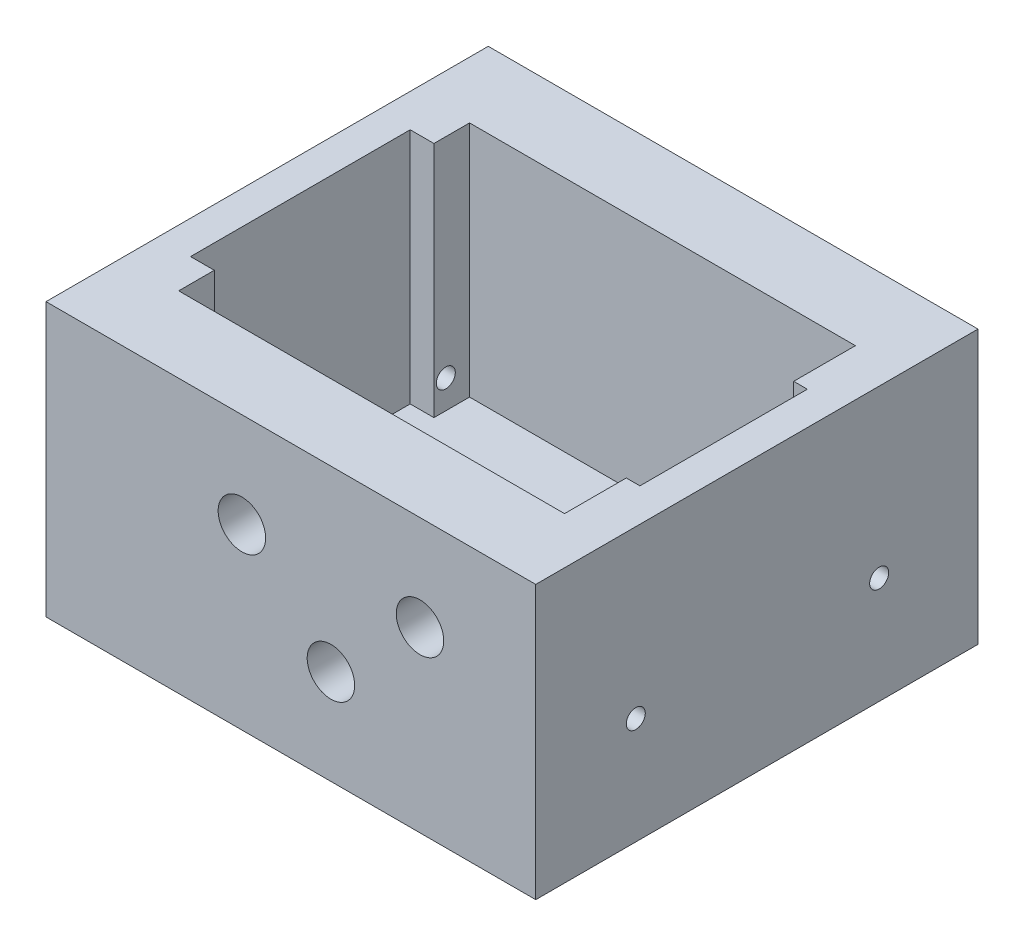
ISO-10303-21;
HEADER;
FILE_DESCRIPTION(('STEP AP214'),'2;1');
FILE_NAME('part.step','',(''),(''),'','','');
FILE_SCHEMA(('AUTOMOTIVE_DESIGN { 1 0 10303 214 1 1 1 1 }'));
ENDSEC;
DATA;
#1=APPLICATION_CONTEXT('core data for automotive mechanical design processes');
#2=APPLICATION_PROTOCOL_DEFINITION('international standard','automotive_design',2000,#1);
#3=PRODUCT_CONTEXT('',#1,'mechanical');
#4=PRODUCT('Part','Part','',(#3));
#5=PRODUCT_RELATED_PRODUCT_CATEGORY('part','',(#4));
#6=PRODUCT_DEFINITION_FORMATION('','',#4);
#7=PRODUCT_DEFINITION_CONTEXT('part definition',#1,'design');
#8=PRODUCT_DEFINITION('design','',#6,#7);
#9=PRODUCT_DEFINITION_SHAPE('','',#8);
#10=(LENGTH_UNIT() NAMED_UNIT(*) SI_UNIT(.MILLI.,.METRE.));
#11=(NAMED_UNIT(*) PLANE_ANGLE_UNIT() SI_UNIT($,.RADIAN.));
#12=(NAMED_UNIT(*) SI_UNIT($,.STERADIAN.) SOLID_ANGLE_UNIT());
#13=UNCERTAINTY_MEASURE_WITH_UNIT(LENGTH_MEASURE(1.E-05),#10,'distance_accuracy_value','');
#14=(GEOMETRIC_REPRESENTATION_CONTEXT(3) GLOBAL_UNCERTAINTY_ASSIGNED_CONTEXT((#13)) GLOBAL_UNIT_ASSIGNED_CONTEXT((#10,
#11,#12)) REPRESENTATION_CONTEXT('',''));
#15=CARTESIAN_POINT('',(0.,0.,0.));
#16=DIRECTION('',(0.,0.,1.));
#17=DIRECTION('',(1.,0.,0.));
#18=AXIS2_PLACEMENT_3D('',#15,#16,#17);
#19=CARTESIAN_POINT('',(0.,23.,0.));
#20=DIRECTION('',(1.,0.,0.));
#21=DIRECTION('',(0.,0.,-1.));
#22=AXIS2_PLACEMENT_3D('',#19,#20,#21);
#23=PLANE('',#22);
#24=CARTESIAN_POINT('',(0.,5.4,-28.875));
#25=DIRECTION('',(1.,0.,0.));
#26=DIRECTION('',(0.,0.,-1.));
#27=AXIS2_PLACEMENT_3D('',#24,#25,#26);
#28=CIRCLE('',#27,0.799999999999999);
#29=CARTESIAN_POINT('',(0.,5.4,-29.675));
#30=VERTEX_POINT('',#29);
#31=EDGE_CURVE('E375',#30,#30,#28,.F.);
#32=ORIENTED_EDGE('',*,*,#31,.F.);
#33=EDGE_LOOP('',(#32));
#34=FACE_BOUND('',#33,.T.);
#35=CARTESIAN_POINT('',(0.,5.4,-8.375));
#36=DIRECTION('',(1.,0.,0.));
#37=DIRECTION('',(0.,0.,-1.));
#38=AXIS2_PLACEMENT_3D('',#35,#36,#37);
#39=CIRCLE('',#38,0.800000000000001);
#40=CARTESIAN_POINT('',(0.,5.4,-9.175));
#41=VERTEX_POINT('',#40);
#42=EDGE_CURVE('E378',#41,#41,#39,.F.);
#43=ORIENTED_EDGE('',*,*,#42,.F.);
#44=EDGE_LOOP('',(#43));
#45=FACE_BOUND('',#44,.T.);
#46=DIRECTION('',(0.,0.,1.));
#47=VECTOR('',#46,1.);
#48=CARTESIAN_POINT('',(0.,0.,0.));
#49=LINE('',#48,#47);
#50=CARTESIAN_POINT('',(0.,0.,-37.25));
#51=VERTEX_POINT('',#50);
#52=CARTESIAN_POINT('',(0.,0.,0.));
#53=VERTEX_POINT('',#52);
#54=EDGE_CURVE('E277',#51,#53,#49,.T.);
#55=ORIENTED_EDGE('',*,*,#54,.T.);
#56=DIRECTION('',(0.,-1.,0.));
#57=VECTOR('',#56,1.);
#58=CARTESIAN_POINT('',(0.,23.,0.));
#59=LINE('',#58,#57);
#60=CARTESIAN_POINT('',(0.,23.,0.));
#61=VERTEX_POINT('',#60);
#62=EDGE_CURVE('E11',#61,#53,#59,.T.);
#63=ORIENTED_EDGE('',*,*,#62,.F.);
#64=DIRECTION('',(0.,0.,1.));
#65=VECTOR('',#64,1.);
#66=CARTESIAN_POINT('',(0.,23.,0.));
#67=LINE('',#66,#65);
#68=CARTESIAN_POINT('',(0.,23.,-37.25));
#69=VERTEX_POINT('',#68);
#70=EDGE_CURVE('E307',#69,#61,#67,.T.);
#71=ORIENTED_EDGE('',*,*,#70,.F.);
#72=DIRECTION('',(0.,-1.,0.));
#73=VECTOR('',#72,1.);
#74=CARTESIAN_POINT('',(0.,23.,-37.25));
#75=LINE('',#74,#73);
#76=EDGE_CURVE('E317',#69,#51,#75,.T.);
#77=ORIENTED_EDGE('',*,*,#76,.T.);
#78=EDGE_LOOP('',(#55,#63,#71,#77));
#79=FACE_BOUND('',#78,.T.);
#80=ADVANCED_FACE('F42',(#34,#45,#79),#23,.F.);
#81=CARTESIAN_POINT('',(0.,23.,0.));
#82=DIRECTION('',(0.,0.,-1.));
#83=DIRECTION('',(-1.,0.,0.));
#84=AXIS2_PLACEMENT_3D('',#81,#82,#83);
#85=PLANE('',#84);
#86=CARTESIAN_POINT('',(16.5,15.,0.));
#87=DIRECTION('',(0.,0.,1.));
#88=DIRECTION('',(1.,0.,0.));
#89=AXIS2_PLACEMENT_3D('',#86,#87,#88);
#90=CIRCLE('',#89,2.);
#91=CARTESIAN_POINT('',(18.5,15.,0.));
#92=VERTEX_POINT('',#91);
#93=EDGE_CURVE('E426',#92,#92,#90,.T.);
#94=ORIENTED_EDGE('',*,*,#93,.F.);
#95=EDGE_LOOP('',(#94));
#96=FACE_BOUND('',#95,.T.);
#97=CARTESIAN_POINT('',(31.5,15.,0.));
#98=DIRECTION('',(0.,0.,1.));
#99=DIRECTION('',(1.,0.,0.));
#100=AXIS2_PLACEMENT_3D('',#97,#98,#99);
#101=CIRCLE('',#100,2.);
#102=CARTESIAN_POINT('',(33.5,15.,0.));
#103=VERTEX_POINT('',#102);
#104=EDGE_CURVE('E422',#103,#103,#101,.T.);
#105=ORIENTED_EDGE('',*,*,#104,.F.);
#106=EDGE_LOOP('',(#105));
#107=FACE_BOUND('',#106,.T.);
#108=CARTESIAN_POINT('',(24.,8.,0.));
#109=DIRECTION('',(0.,0.,1.));
#110=DIRECTION('',(1.,0.,0.));
#111=AXIS2_PLACEMENT_3D('',#108,#109,#110);
#112=CIRCLE('',#111,2.);
#113=CARTESIAN_POINT('',(26.,8.,0.));
#114=VERTEX_POINT('',#113);
#115=EDGE_CURVE('E413',#114,#114,#112,.T.);
#116=ORIENTED_EDGE('',*,*,#115,.F.);
#117=EDGE_LOOP('',(#116));
#118=FACE_BOUND('',#117,.T.);
#119=DIRECTION('',(1.,0.,0.));
#120=VECTOR('',#119,1.);
#121=CARTESIAN_POINT('',(0.,0.,0.));
#122=LINE('',#121,#120);
#123=CARTESIAN_POINT('',(41.25,0.,0.));
#124=VERTEX_POINT('',#123);
#125=EDGE_CURVE('E321',#53,#124,#122,.T.);
#126=ORIENTED_EDGE('',*,*,#125,.T.);
#127=DIRECTION('',(0.,-1.,0.));
#128=VECTOR('',#127,1.);
#129=CARTESIAN_POINT('',(41.25,23.,0.));
#130=LINE('',#129,#128);
#131=CARTESIAN_POINT('',(41.25,23.,0.));
#132=VERTEX_POINT('',#131);
#133=EDGE_CURVE('E50',#132,#124,#130,.T.);
#134=ORIENTED_EDGE('',*,*,#133,.F.);
#135=DIRECTION('',(1.,0.,0.));
#136=VECTOR('',#135,1.);
#137=CARTESIAN_POINT('',(0.,23.,0.));
#138=LINE('',#137,#136);
#139=EDGE_CURVE('E94',#61,#132,#138,.T.);
#140=ORIENTED_EDGE('',*,*,#139,.F.);
#141=ORIENTED_EDGE('',*,*,#62,.T.);
#142=EDGE_LOOP('',(#126,#134,#140,#141));
#143=FACE_BOUND('',#142,.T.);
#144=ADVANCED_FACE('F359',(#96,#107,#118,#143),#85,.F.);
#145=CARTESIAN_POINT('',(41.25,23.,0.));
#146=DIRECTION('',(-1.,0.,0.));
#147=DIRECTION('',(0.,0.,1.));
#148=AXIS2_PLACEMENT_3D('',#145,#146,#147);
#149=PLANE('',#148);
#150=CARTESIAN_POINT('',(41.25,9.,-28.925));
#151=DIRECTION('',(-1.,0.,0.));
#152=DIRECTION('',(0.,0.,1.));
#153=AXIS2_PLACEMENT_3D('',#150,#151,#152);
#154=CIRCLE('',#153,0.799999999999999);
#155=CARTESIAN_POINT('',(41.25,9.,-28.125));
#156=VERTEX_POINT('',#155);
#157=EDGE_CURVE('E236',#156,#156,#154,.F.);
#158=ORIENTED_EDGE('',*,*,#157,.F.);
#159=EDGE_LOOP('',(#158));
#160=FACE_BOUND('',#159,.T.);
#161=CARTESIAN_POINT('',(41.25,9.,-8.425));
#162=DIRECTION('',(-1.,0.,0.));
#163=DIRECTION('',(0.,0.,1.));
#164=AXIS2_PLACEMENT_3D('',#161,#162,#163);
#165=CIRCLE('',#164,0.800000000000002);
#166=CARTESIAN_POINT('',(41.25,9.,-7.625));
#167=VERTEX_POINT('',#166);
#168=EDGE_CURVE('E195',#167,#167,#165,.F.);
#169=ORIENTED_EDGE('',*,*,#168,.F.);
#170=EDGE_LOOP('',(#169));
#171=FACE_BOUND('',#170,.T.);
#172=DIRECTION('',(0.,0.,-1.));
#173=VECTOR('',#172,1.);
#174=CARTESIAN_POINT('',(41.25,0.,0.));
#175=LINE('',#174,#173);
#176=CARTESIAN_POINT('',(41.25,0.,-37.25));
#177=VERTEX_POINT('',#176);
#178=EDGE_CURVE('E324',#124,#177,#175,.T.);
#179=ORIENTED_EDGE('',*,*,#178,.T.);
#180=DIRECTION('',(0.,-1.,0.));
#181=VECTOR('',#180,1.);
#182=CARTESIAN_POINT('',(41.25,23.,-37.25));
#183=LINE('',#182,#181);
#184=CARTESIAN_POINT('',(41.25,23.,-37.25));
#185=VERTEX_POINT('',#184);
#186=EDGE_CURVE('E331',#185,#177,#183,.T.);
#187=ORIENTED_EDGE('',*,*,#186,.F.);
#188=DIRECTION('',(0.,0.,-1.));
#189=VECTOR('',#188,1.);
#190=CARTESIAN_POINT('',(41.25,23.,0.));
#191=LINE('',#190,#189);
#192=EDGE_CURVE('E312',#132,#185,#191,.T.);
#193=ORIENTED_EDGE('',*,*,#192,.F.);
#194=ORIENTED_EDGE('',*,*,#133,.T.);
#195=EDGE_LOOP('',(#179,#187,#193,#194));
#196=FACE_BOUND('',#195,.T.);
#197=ADVANCED_FACE('F338',(#160,#171,#196),#149,.F.);
#198=CARTESIAN_POINT('',(0.,23.,-37.25));
#199=DIRECTION('',(0.,0.,1.));
#200=DIRECTION('',(1.,0.,0.));
#201=AXIS2_PLACEMENT_3D('',#198,#199,#200);
#202=PLANE('',#201);
#203=CARTESIAN_POINT('',(16.5,15.,-37.25));
#204=DIRECTION('',(0.,0.,1.));
#205=DIRECTION('',(1.,0.,0.));
#206=AXIS2_PLACEMENT_3D('',#203,#204,#205);
#207=CIRCLE('',#206,2.);
#208=CARTESIAN_POINT('',(18.5,15.,-37.25));
#209=VERTEX_POINT('',#208);
#210=EDGE_CURVE('E449',#209,#209,#207,.T.);
#211=ORIENTED_EDGE('',*,*,#210,.T.);
#212=EDGE_LOOP('',(#211));
#213=FACE_BOUND('',#212,.T.);
#214=CARTESIAN_POINT('',(31.5,15.,-37.25));
#215=DIRECTION('',(0.,0.,1.));
#216=DIRECTION('',(1.,0.,0.));
#217=AXIS2_PLACEMENT_3D('',#214,#215,#216);
#218=CIRCLE('',#217,2.);
#219=CARTESIAN_POINT('',(33.5,15.,-37.25));
#220=VERTEX_POINT('',#219);
#221=EDGE_CURVE('E441',#220,#220,#218,.T.);
#222=ORIENTED_EDGE('',*,*,#221,.T.);
#223=EDGE_LOOP('',(#222));
#224=FACE_BOUND('',#223,.T.);
#225=CARTESIAN_POINT('',(24.,8.,-37.25));
#226=DIRECTION('',(0.,0.,1.));
#227=DIRECTION('',(1.,0.,0.));
#228=AXIS2_PLACEMENT_3D('',#225,#226,#227);
#229=CIRCLE('',#228,2.);
#230=CARTESIAN_POINT('',(26.,8.,-37.25));
#231=VERTEX_POINT('',#230);
#232=EDGE_CURVE('E433',#231,#231,#229,.T.);
#233=ORIENTED_EDGE('',*,*,#232,.T.);
#234=EDGE_LOOP('',(#233));
#235=FACE_BOUND('',#234,.T.);
#236=DIRECTION('',(-1.,0.,0.));
#237=VECTOR('',#236,1.);
#238=CARTESIAN_POINT('',(0.,0.,-37.25));
#239=LINE('',#238,#237);
#240=EDGE_CURVE('E87',#177,#51,#239,.T.);
#241=ORIENTED_EDGE('',*,*,#240,.T.);
#242=ORIENTED_EDGE('',*,*,#76,.F.);
#243=DIRECTION('',(-1.,0.,0.));
#244=VECTOR('',#243,1.);
#245=CARTESIAN_POINT('',(0.,23.,-37.25));
#246=LINE('',#245,#244);
#247=EDGE_CURVE('E66',#185,#69,#246,.T.);
#248=ORIENTED_EDGE('',*,*,#247,.F.);
#249=ORIENTED_EDGE('',*,*,#186,.T.);
#250=EDGE_LOOP('',(#241,#242,#248,#249));
#251=FACE_BOUND('',#250,.T.);
#252=ADVANCED_FACE('F346',(#213,#224,#235,#251),#202,.F.);
#253=CARTESIAN_POINT('',(0.,23.,0.));
#254=DIRECTION('',(0.,-1.,0.));
#255=DIRECTION('',(0.,0.,-1.));
#256=AXIS2_PLACEMENT_3D('',#253,#254,#255);
#257=PLANE('',#256);
#258=DIRECTION('',(-1.,0.,0.));
#259=VECTOR('',#258,1.);
#260=CARTESIAN_POINT('',(4.8,23.,-27.875));
#261=LINE('',#260,#259);
#262=CARTESIAN_POINT('',(4.8,23.,-27.875));
#263=VERTEX_POINT('',#262);
#264=CARTESIAN_POINT('',(2.80000000000001,23.,-27.875));
#265=VERTEX_POINT('',#264);
#266=EDGE_CURVE('E235',#263,#265,#261,.T.);
#267=ORIENTED_EDGE('',*,*,#266,.F.);
#268=DIRECTION('',(0.,0.,1.));
#269=VECTOR('',#268,1.);
#270=CARTESIAN_POINT('',(4.8,23.,-30.875));
#271=LINE('',#270,#269);
#272=CARTESIAN_POINT('',(4.8,23.,-30.875));
#273=VERTEX_POINT('',#272);
#274=EDGE_CURVE('E57',#273,#263,#271,.T.);
#275=ORIENTED_EDGE('',*,*,#274,.F.);
#276=DIRECTION('',(-1.,0.,0.));
#277=VECTOR('',#276,1.);
#278=CARTESIAN_POINT('',(37.3,23.,-30.875));
#279=LINE('',#278,#277);
#280=CARTESIAN_POINT('',(37.3,23.,-30.875));
#281=VERTEX_POINT('',#280);
#282=EDGE_CURVE('E188',#281,#273,#279,.T.);
#283=ORIENTED_EDGE('',*,*,#282,.F.);
#284=DIRECTION('',(0.,0.,-1.));
#285=VECTOR('',#284,1.);
#286=CARTESIAN_POINT('',(37.3,23.,-25.675));
#287=LINE('',#286,#285);
#288=CARTESIAN_POINT('',(37.3,23.,-25.675));
#289=VERTEX_POINT('',#288);
#290=EDGE_CURVE('E192',#289,#281,#287,.T.);
#291=ORIENTED_EDGE('',*,*,#290,.F.);
#292=DIRECTION('',(-1.,0.,0.));
#293=VECTOR('',#292,1.);
#294=CARTESIAN_POINT('',(38.45,23.,-25.675));
#295=LINE('',#294,#293);
#296=CARTESIAN_POINT('',(38.45,23.,-25.675));
#297=VERTEX_POINT('',#296);
#298=EDGE_CURVE('E267',#297,#289,#295,.T.);
#299=ORIENTED_EDGE('',*,*,#298,.F.);
#300=DIRECTION('',(0.,0.,-1.));
#301=VECTOR('',#300,1.);
#302=CARTESIAN_POINT('',(38.45,23.,-11.575));
#303=LINE('',#302,#301);
#304=CARTESIAN_POINT('',(38.45,23.,-11.575));
#305=VERTEX_POINT('',#304);
#306=EDGE_CURVE('E263',#305,#297,#303,.T.);
#307=ORIENTED_EDGE('',*,*,#306,.F.);
#308=DIRECTION('',(1.,0.,0.));
#309=VECTOR('',#308,1.);
#310=CARTESIAN_POINT('',(37.3,23.,-11.575));
#311=LINE('',#310,#309);
#312=CARTESIAN_POINT('',(37.3,23.,-11.575));
#313=VERTEX_POINT('',#312);
#314=EDGE_CURVE('E259',#313,#305,#311,.T.);
#315=ORIENTED_EDGE('',*,*,#314,.F.);
#316=DIRECTION('',(0.,0.,-1.));
#317=VECTOR('',#316,1.);
#318=CARTESIAN_POINT('',(37.3,23.,-6.375));
#319=LINE('',#318,#317);
#320=CARTESIAN_POINT('',(37.3,23.,-6.375));
#321=VERTEX_POINT('',#320);
#322=EDGE_CURVE('E255',#321,#313,#319,.T.);
#323=ORIENTED_EDGE('',*,*,#322,.F.);
#324=DIRECTION('',(1.,0.,0.));
#325=VECTOR('',#324,1.);
#326=CARTESIAN_POINT('',(4.80000000000001,23.,-6.375));
#327=LINE('',#326,#325);
#328=CARTESIAN_POINT('',(4.80000000000001,23.,-6.375));
#329=VERTEX_POINT('',#328);
#330=EDGE_CURVE('E251',#329,#321,#327,.T.);
#331=ORIENTED_EDGE('',*,*,#330,.F.);
#332=DIRECTION('',(0.,0.,1.));
#333=VECTOR('',#332,1.);
#334=CARTESIAN_POINT('',(4.80000000000001,23.,-9.375));
#335=LINE('',#334,#333);
#336=CARTESIAN_POINT('',(4.80000000000001,23.,-9.375));
#337=VERTEX_POINT('',#336);
#338=EDGE_CURVE('E247',#337,#329,#335,.T.);
#339=ORIENTED_EDGE('',*,*,#338,.F.);
#340=DIRECTION('',(1.,0.,0.));
#341=VECTOR('',#340,1.);
#342=CARTESIAN_POINT('',(2.80000000000001,23.,-9.375));
#343=LINE('',#342,#341);
#344=CARTESIAN_POINT('',(2.80000000000001,23.,-9.375));
#345=VERTEX_POINT('',#344);
#346=EDGE_CURVE('E243',#345,#337,#343,.T.);
#347=ORIENTED_EDGE('',*,*,#346,.F.);
#348=DIRECTION('',(0.,0.,1.));
#349=VECTOR('',#348,1.);
#350=CARTESIAN_POINT('',(2.80000000000001,23.,-27.875));
#351=LINE('',#350,#349);
#352=EDGE_CURVE('E239',#265,#345,#351,.T.);
#353=ORIENTED_EDGE('',*,*,#352,.F.);
#354=EDGE_LOOP('',(#267,#275,#283,#291,#299,#307,#315,#323,#331,#339,#347,#353));
#355=FACE_BOUND('',#354,.T.);
#356=ORIENTED_EDGE('',*,*,#70,.T.);
#357=ORIENTED_EDGE('',*,*,#139,.T.);
#358=ORIENTED_EDGE('',*,*,#192,.T.);
#359=ORIENTED_EDGE('',*,*,#247,.T.);
#360=EDGE_LOOP('',(#356,#357,#358,#359));
#361=FACE_BOUND('',#360,.T.);
#362=ADVANCED_FACE('F348',(#355,#361),#257,.F.);
#363=CARTESIAN_POINT('',(0.,0.,0.));
#364=DIRECTION('',(0.,-1.,0.));
#365=DIRECTION('',(0.,0.,-1.));
#366=AXIS2_PLACEMENT_3D('',#363,#364,#365);
#367=PLANE('',#366);
#368=ORIENTED_EDGE('',*,*,#54,.F.);
#369=ORIENTED_EDGE('',*,*,#240,.F.);
#370=ORIENTED_EDGE('',*,*,#178,.F.);
#371=ORIENTED_EDGE('',*,*,#125,.F.);
#372=EDGE_LOOP('',(#368,#369,#370,#371));
#373=FACE_BOUND('',#372,.T.);
#374=ADVANCED_FACE('F342',(#373),#367,.T.);
#375=CARTESIAN_POINT('',(4.8,3.,-30.875));
#376=DIRECTION('',(-1.,0.,0.));
#377=DIRECTION('',(0.,0.,1.));
#378=AXIS2_PLACEMENT_3D('',#375,#376,#377);
#379=PLANE('',#378);
#380=CARTESIAN_POINT('',(4.8,5.4,-28.875));
#381=DIRECTION('',(1.,0.,0.));
#382=DIRECTION('',(0.,0.,-1.));
#383=AXIS2_PLACEMENT_3D('',#380,#381,#382);
#384=CIRCLE('',#383,0.799999999999999);
#385=CARTESIAN_POINT('',(4.8,5.4,-29.675));
#386=VERTEX_POINT('',#385);
#387=EDGE_CURVE('E381',#386,#386,#384,.T.);
#388=ORIENTED_EDGE('',*,*,#387,.F.);
#389=EDGE_LOOP('',(#388));
#390=FACE_BOUND('',#389,.T.);
#391=ORIENTED_EDGE('',*,*,#274,.T.);
#392=DIRECTION('',(0.,1.,0.));
#393=VECTOR('',#392,1.);
#394=CARTESIAN_POINT('',(4.8,3.,-27.875));
#395=LINE('',#394,#393);
#396=CARTESIAN_POINT('',(4.8,3.,-27.875));
#397=VERTEX_POINT('',#396);
#398=EDGE_CURVE('E162',#397,#263,#395,.T.);
#399=ORIENTED_EDGE('',*,*,#398,.F.);
#400=DIRECTION('',(0.,0.,1.));
#401=VECTOR('',#400,1.);
#402=CARTESIAN_POINT('',(4.8,3.,-30.875));
#403=LINE('',#402,#401);
#404=CARTESIAN_POINT('',(4.8,3.,-30.875));
#405=VERTEX_POINT('',#404);
#406=EDGE_CURVE('E166',#405,#397,#403,.T.);
#407=ORIENTED_EDGE('',*,*,#406,.F.);
#408=DIRECTION('',(0.,1.,0.));
#409=VECTOR('',#408,1.);
#410=CARTESIAN_POINT('',(4.8,3.,-30.875));
#411=LINE('',#410,#409);
#412=EDGE_CURVE('E274',#405,#273,#411,.T.);
#413=ORIENTED_EDGE('',*,*,#412,.T.);
#414=EDGE_LOOP('',(#391,#399,#407,#413));
#415=FACE_BOUND('',#414,.T.);
#416=ADVANCED_FACE('F164',(#390,#415),#379,.F.);
#417=CARTESIAN_POINT('',(37.3,3.,-30.875));
#418=DIRECTION('',(0.,0.,-1.));
#419=DIRECTION('',(-1.,0.,0.));
#420=AXIS2_PLACEMENT_3D('',#417,#418,#419);
#421=PLANE('',#420);
#422=ORIENTED_EDGE('',*,*,#282,.T.);
#423=ORIENTED_EDGE('',*,*,#412,.F.);
#424=DIRECTION('',(-1.,0.,0.));
#425=VECTOR('',#424,1.);
#426=CARTESIAN_POINT('',(37.3,3.,-30.875));
#427=LINE('',#426,#425);
#428=CARTESIAN_POINT('',(37.3,3.,-30.875));
#429=VERTEX_POINT('',#428);
#430=EDGE_CURVE('E173',#429,#405,#427,.T.);
#431=ORIENTED_EDGE('',*,*,#430,.F.);
#432=DIRECTION('',(0.,1.,0.));
#433=VECTOR('',#432,1.);
#434=CARTESIAN_POINT('',(37.3,3.,-30.875));
#435=LINE('',#434,#433);
#436=EDGE_CURVE('E278',#429,#281,#435,.T.);
#437=ORIENTED_EDGE('',*,*,#436,.T.);
#438=EDGE_LOOP('',(#422,#423,#431,#437));
#439=FACE_BOUND('',#438,.T.);
#440=ADVANCED_FACE('F523',(#439),#421,.F.);
#441=CARTESIAN_POINT('',(37.3,3.,-25.675));
#442=DIRECTION('',(1.,0.,0.));
#443=DIRECTION('',(0.,0.,-1.));
#444=AXIS2_PLACEMENT_3D('',#441,#442,#443);
#445=PLANE('',#444);
#446=CARTESIAN_POINT('',(37.3,9.,-28.925));
#447=DIRECTION('',(-1.,0.,0.));
#448=DIRECTION('',(0.,0.,1.));
#449=AXIS2_PLACEMENT_3D('',#446,#447,#448);
#450=CIRCLE('',#449,0.799999999999999);
#451=CARTESIAN_POINT('',(37.3,9.,-28.125));
#452=VERTEX_POINT('',#451);
#453=EDGE_CURVE('E393',#452,#452,#450,.T.);
#454=ORIENTED_EDGE('',*,*,#453,.F.);
#455=EDGE_LOOP('',(#454));
#456=FACE_BOUND('',#455,.T.);
#457=ORIENTED_EDGE('',*,*,#290,.T.);
#458=ORIENTED_EDGE('',*,*,#436,.F.);
#459=DIRECTION('',(0.,0.,-1.));
#460=VECTOR('',#459,1.);
#461=CARTESIAN_POINT('',(37.3,3.,-25.675));
#462=LINE('',#461,#460);
#463=CARTESIAN_POINT('',(37.3,3.,-25.675));
#464=VERTEX_POINT('',#463);
#465=EDGE_CURVE('E228',#464,#429,#462,.T.);
#466=ORIENTED_EDGE('',*,*,#465,.F.);
#467=DIRECTION('',(0.,1.,0.));
#468=VECTOR('',#467,1.);
#469=CARTESIAN_POINT('',(37.3,3.,-25.675));
#470=LINE('',#469,#468);
#471=EDGE_CURVE('E281',#464,#289,#470,.T.);
#472=ORIENTED_EDGE('',*,*,#471,.T.);
#473=EDGE_LOOP('',(#457,#458,#466,#472));
#474=FACE_BOUND('',#473,.T.);
#475=ADVANCED_FACE('F526',(#456,#474),#445,.F.);
#476=CARTESIAN_POINT('',(38.45,3.,-25.675));
#477=DIRECTION('',(0.,0.,-1.));
#478=DIRECTION('',(-1.,0.,0.));
#479=AXIS2_PLACEMENT_3D('',#476,#477,#478);
#480=PLANE('',#479);
#481=ORIENTED_EDGE('',*,*,#298,.T.);
#482=ORIENTED_EDGE('',*,*,#471,.F.);
#483=DIRECTION('',(-1.,0.,0.));
#484=VECTOR('',#483,1.);
#485=CARTESIAN_POINT('',(38.45,3.,-25.675));
#486=LINE('',#485,#484);
#487=CARTESIAN_POINT('',(38.45,3.,-25.675));
#488=VERTEX_POINT('',#487);
#489=EDGE_CURVE('E224',#488,#464,#486,.T.);
#490=ORIENTED_EDGE('',*,*,#489,.F.);
#491=DIRECTION('',(0.,1.,0.));
#492=VECTOR('',#491,1.);
#493=CARTESIAN_POINT('',(38.45,3.,-25.675));
#494=LINE('',#493,#492);
#495=EDGE_CURVE('E284',#488,#297,#494,.T.);
#496=ORIENTED_EDGE('',*,*,#495,.T.);
#497=EDGE_LOOP('',(#481,#482,#490,#496));
#498=FACE_BOUND('',#497,.T.);
#499=ADVANCED_FACE('F530',(#498),#480,.F.);
#500=CARTESIAN_POINT('',(38.45,3.,-11.575));
#501=DIRECTION('',(1.,0.,0.));
#502=DIRECTION('',(0.,0.,-1.));
#503=AXIS2_PLACEMENT_3D('',#500,#501,#502);
#504=PLANE('',#503);
#505=ORIENTED_EDGE('',*,*,#306,.T.);
#506=ORIENTED_EDGE('',*,*,#495,.F.);
#507=DIRECTION('',(0.,0.,-1.));
#508=VECTOR('',#507,1.);
#509=CARTESIAN_POINT('',(38.45,3.,-11.575));
#510=LINE('',#509,#508);
#511=CARTESIAN_POINT('',(38.45,3.,-11.575));
#512=VERTEX_POINT('',#511);
#513=EDGE_CURVE('E220',#512,#488,#510,.T.);
#514=ORIENTED_EDGE('',*,*,#513,.F.);
#515=DIRECTION('',(0.,1.,0.));
#516=VECTOR('',#515,1.);
#517=CARTESIAN_POINT('',(38.45,3.,-11.575));
#518=LINE('',#517,#516);
#519=EDGE_CURVE('E287',#512,#305,#518,.T.);
#520=ORIENTED_EDGE('',*,*,#519,.T.);
#521=EDGE_LOOP('',(#505,#506,#514,#520));
#522=FACE_BOUND('',#521,.T.);
#523=ADVANCED_FACE('F534',(#522),#504,.F.);
#524=CARTESIAN_POINT('',(37.3,3.,-11.575));
#525=DIRECTION('',(0.,0.,1.));
#526=DIRECTION('',(1.,0.,0.));
#527=AXIS2_PLACEMENT_3D('',#524,#525,#526);
#528=PLANE('',#527);
#529=ORIENTED_EDGE('',*,*,#314,.T.);
#530=ORIENTED_EDGE('',*,*,#519,.F.);
#531=DIRECTION('',(1.,0.,0.));
#532=VECTOR('',#531,1.);
#533=CARTESIAN_POINT('',(37.3,3.,-11.575));
#534=LINE('',#533,#532);
#535=CARTESIAN_POINT('',(37.3,3.,-11.575));
#536=VERTEX_POINT('',#535);
#537=EDGE_CURVE('E216',#536,#512,#534,.T.);
#538=ORIENTED_EDGE('',*,*,#537,.F.);
#539=DIRECTION('',(0.,1.,0.));
#540=VECTOR('',#539,1.);
#541=CARTESIAN_POINT('',(37.3,3.,-11.575));
#542=LINE('',#541,#540);
#543=EDGE_CURVE('E290',#536,#313,#542,.T.);
#544=ORIENTED_EDGE('',*,*,#543,.T.);
#545=EDGE_LOOP('',(#529,#530,#538,#544));
#546=FACE_BOUND('',#545,.T.);
#547=ADVANCED_FACE('F538',(#546),#528,.F.);
#548=CARTESIAN_POINT('',(37.3,3.,-6.375));
#549=DIRECTION('',(1.,0.,0.));
#550=DIRECTION('',(0.,0.,-1.));
#551=AXIS2_PLACEMENT_3D('',#548,#549,#550);
#552=PLANE('',#551);
#553=CARTESIAN_POINT('',(37.3,9.,-8.425));
#554=DIRECTION('',(-1.,0.,0.));
#555=DIRECTION('',(0.,0.,1.));
#556=AXIS2_PLACEMENT_3D('',#553,#554,#555);
#557=CIRCLE('',#556,0.800000000000002);
#558=CARTESIAN_POINT('',(37.3,9.,-7.625));
#559=VERTEX_POINT('',#558);
#560=EDGE_CURVE('E399',#559,#559,#557,.T.);
#561=ORIENTED_EDGE('',*,*,#560,.F.);
#562=EDGE_LOOP('',(#561));
#563=FACE_BOUND('',#562,.T.);
#564=ORIENTED_EDGE('',*,*,#322,.T.);
#565=ORIENTED_EDGE('',*,*,#543,.F.);
#566=DIRECTION('',(0.,0.,-1.));
#567=VECTOR('',#566,1.);
#568=CARTESIAN_POINT('',(37.3,3.,-6.375));
#569=LINE('',#568,#567);
#570=CARTESIAN_POINT('',(37.3,3.,-6.375));
#571=VERTEX_POINT('',#570);
#572=EDGE_CURVE('E212',#571,#536,#569,.T.);
#573=ORIENTED_EDGE('',*,*,#572,.F.);
#574=DIRECTION('',(0.,1.,0.));
#575=VECTOR('',#574,1.);
#576=CARTESIAN_POINT('',(37.3,3.,-6.375));
#577=LINE('',#576,#575);
#578=EDGE_CURVE('E293',#571,#321,#577,.T.);
#579=ORIENTED_EDGE('',*,*,#578,.T.);
#580=EDGE_LOOP('',(#564,#565,#573,#579));
#581=FACE_BOUND('',#580,.T.);
#582=ADVANCED_FACE('F542',(#563,#581),#552,.F.);
#583=CARTESIAN_POINT('',(4.80000000000001,3.,-6.375));
#584=DIRECTION('',(0.,0.,1.));
#585=DIRECTION('',(1.,0.,0.));
#586=AXIS2_PLACEMENT_3D('',#583,#584,#585);
#587=PLANE('',#586);
#588=ORIENTED_EDGE('',*,*,#330,.T.);
#589=ORIENTED_EDGE('',*,*,#578,.F.);
#590=DIRECTION('',(1.,0.,0.));
#591=VECTOR('',#590,1.);
#592=CARTESIAN_POINT('',(4.80000000000001,3.,-6.375));
#593=LINE('',#592,#591);
#594=CARTESIAN_POINT('',(4.80000000000001,3.,-6.375));
#595=VERTEX_POINT('',#594);
#596=EDGE_CURVE('E208',#595,#571,#593,.T.);
#597=ORIENTED_EDGE('',*,*,#596,.F.);
#598=DIRECTION('',(0.,1.,0.));
#599=VECTOR('',#598,1.);
#600=CARTESIAN_POINT('',(4.80000000000001,3.,-6.375));
#601=LINE('',#600,#599);
#602=EDGE_CURVE('E296',#595,#329,#601,.T.);
#603=ORIENTED_EDGE('',*,*,#602,.T.);
#604=EDGE_LOOP('',(#588,#589,#597,#603));
#605=FACE_BOUND('',#604,.T.);
#606=ADVANCED_FACE('F546',(#605),#587,.F.);
#607=CARTESIAN_POINT('',(4.80000000000001,3.,-9.375));
#608=DIRECTION('',(-1.,0.,0.));
#609=DIRECTION('',(0.,0.,1.));
#610=AXIS2_PLACEMENT_3D('',#607,#608,#609);
#611=PLANE('',#610);
#612=CARTESIAN_POINT('',(4.8,5.4,-8.375));
#613=DIRECTION('',(1.,0.,0.));
#614=DIRECTION('',(0.,0.,-1.));
#615=AXIS2_PLACEMENT_3D('',#612,#613,#614);
#616=CIRCLE('',#615,0.800000000000001);
#617=CARTESIAN_POINT('',(4.8,5.4,-9.175));
#618=VERTEX_POINT('',#617);
#619=EDGE_CURVE('E382',#618,#618,#616,.T.);
#620=ORIENTED_EDGE('',*,*,#619,.F.);
#621=EDGE_LOOP('',(#620));
#622=FACE_BOUND('',#621,.T.);
#623=ORIENTED_EDGE('',*,*,#338,.T.);
#624=ORIENTED_EDGE('',*,*,#602,.F.);
#625=DIRECTION('',(0.,0.,1.));
#626=VECTOR('',#625,1.);
#627=CARTESIAN_POINT('',(4.80000000000001,3.,-9.375));
#628=LINE('',#627,#626);
#629=CARTESIAN_POINT('',(4.80000000000001,3.,-9.375));
#630=VERTEX_POINT('',#629);
#631=EDGE_CURVE('E204',#630,#595,#628,.T.);
#632=ORIENTED_EDGE('',*,*,#631,.F.);
#633=DIRECTION('',(0.,1.,0.));
#634=VECTOR('',#633,1.);
#635=CARTESIAN_POINT('',(4.80000000000001,3.,-9.375));
#636=LINE('',#635,#634);
#637=EDGE_CURVE('E299',#630,#337,#636,.T.);
#638=ORIENTED_EDGE('',*,*,#637,.T.);
#639=EDGE_LOOP('',(#623,#624,#632,#638));
#640=FACE_BOUND('',#639,.T.);
#641=ADVANCED_FACE('F550',(#622,#640),#611,.F.);
#642=CARTESIAN_POINT('',(2.80000000000001,3.,-9.375));
#643=DIRECTION('',(0.,0.,1.));
#644=DIRECTION('',(1.,0.,0.));
#645=AXIS2_PLACEMENT_3D('',#642,#643,#644);
#646=PLANE('',#645);
#647=ORIENTED_EDGE('',*,*,#346,.T.);
#648=ORIENTED_EDGE('',*,*,#637,.F.);
#649=DIRECTION('',(1.,0.,0.));
#650=VECTOR('',#649,1.);
#651=CARTESIAN_POINT('',(2.80000000000001,3.,-9.375));
#652=LINE('',#651,#650);
#653=CARTESIAN_POINT('',(2.80000000000001,3.,-9.375));
#654=VERTEX_POINT('',#653);
#655=EDGE_CURVE('E200',#654,#630,#652,.T.);
#656=ORIENTED_EDGE('',*,*,#655,.F.);
#657=DIRECTION('',(0.,1.,0.));
#658=VECTOR('',#657,1.);
#659=CARTESIAN_POINT('',(2.80000000000001,3.,-9.375));
#660=LINE('',#659,#658);
#661=EDGE_CURVE('E302',#654,#345,#660,.T.);
#662=ORIENTED_EDGE('',*,*,#661,.T.);
#663=EDGE_LOOP('',(#647,#648,#656,#662));
#664=FACE_BOUND('',#663,.T.);
#665=ADVANCED_FACE('F554',(#664),#646,.F.);
#666=CARTESIAN_POINT('',(2.80000000000001,3.,-27.875));
#667=DIRECTION('',(-1.,0.,0.));
#668=DIRECTION('',(0.,0.,1.));
#669=AXIS2_PLACEMENT_3D('',#666,#667,#668);
#670=PLANE('',#669);
#671=ORIENTED_EDGE('',*,*,#352,.T.);
#672=ORIENTED_EDGE('',*,*,#661,.F.);
#673=DIRECTION('',(0.,0.,1.));
#674=VECTOR('',#673,1.);
#675=CARTESIAN_POINT('',(2.80000000000001,3.,-27.875));
#676=LINE('',#675,#674);
#677=CARTESIAN_POINT('',(2.80000000000001,3.,-27.875));
#678=VERTEX_POINT('',#677);
#679=EDGE_CURVE('E182',#678,#654,#676,.T.);
#680=ORIENTED_EDGE('',*,*,#679,.F.);
#681=DIRECTION('',(0.,1.,0.));
#682=VECTOR('',#681,1.);
#683=CARTESIAN_POINT('',(2.80000000000001,3.,-27.875));
#684=LINE('',#683,#682);
#685=EDGE_CURVE('E172',#678,#265,#684,.T.);
#686=ORIENTED_EDGE('',*,*,#685,.T.);
#687=EDGE_LOOP('',(#671,#672,#680,#686));
#688=FACE_BOUND('',#687,.T.);
#689=ADVANCED_FACE('F558',(#688),#670,.F.);
#690=CARTESIAN_POINT('',(4.8,3.,-27.875));
#691=DIRECTION('',(0.,0.,-1.));
#692=DIRECTION('',(-1.,0.,0.));
#693=AXIS2_PLACEMENT_3D('',#690,#691,#692);
#694=PLANE('',#693);
#695=ORIENTED_EDGE('',*,*,#266,.T.);
#696=ORIENTED_EDGE('',*,*,#685,.F.);
#697=DIRECTION('',(-1.,0.,0.));
#698=VECTOR('',#697,1.);
#699=CARTESIAN_POINT('',(4.8,3.,-27.875));
#700=LINE('',#699,#698);
#701=EDGE_CURVE('E176',#397,#678,#700,.T.);
#702=ORIENTED_EDGE('',*,*,#701,.F.);
#703=ORIENTED_EDGE('',*,*,#398,.T.);
#704=EDGE_LOOP('',(#695,#696,#702,#703));
#705=FACE_BOUND('',#704,.T.);
#706=ADVANCED_FACE('F177',(#705),#694,.F.);
#707=CARTESIAN_POINT('',(0.,3.,0.));
#708=DIRECTION('',(0.,-1.,0.));
#709=DIRECTION('',(0.,0.,-1.));
#710=AXIS2_PLACEMENT_3D('',#707,#708,#709);
#711=PLANE('',#710);
#712=ORIENTED_EDGE('',*,*,#406,.T.);
#713=ORIENTED_EDGE('',*,*,#701,.T.);
#714=ORIENTED_EDGE('',*,*,#679,.T.);
#715=ORIENTED_EDGE('',*,*,#655,.T.);
#716=ORIENTED_EDGE('',*,*,#631,.T.);
#717=ORIENTED_EDGE('',*,*,#596,.T.);
#718=ORIENTED_EDGE('',*,*,#572,.T.);
#719=ORIENTED_EDGE('',*,*,#537,.T.);
#720=ORIENTED_EDGE('',*,*,#513,.T.);
#721=ORIENTED_EDGE('',*,*,#489,.T.);
#722=ORIENTED_EDGE('',*,*,#465,.T.);
#723=ORIENTED_EDGE('',*,*,#430,.T.);
#724=EDGE_LOOP('',(#712,#713,#714,#715,#716,#717,#718,#719,#720,#721,#722,#723));
#725=FACE_BOUND('',#724,.T.);
#726=ADVANCED_FACE('F184',(#725),#711,.F.);
#727=CARTESIAN_POINT('',(43.512741699797,9.,-8.425));
#728=DIRECTION('',(-1.,0.,0.));
#729=DIRECTION('',(0.,0.,1.));
#730=AXIS2_PLACEMENT_3D('',#727,#728,#729);
#731=CYLINDRICAL_SURFACE('',#730,0.800000000000002);
#732=ORIENTED_EDGE('',*,*,#168,.T.);
#733=EDGE_LOOP('',(#732));
#734=FACE_BOUND('',#733,.T.);
#735=ORIENTED_EDGE('',*,*,#560,.T.);
#736=EDGE_LOOP('',(#735));
#737=FACE_BOUND('',#736,.T.);
#738=ADVANCED_FACE('F516',(#734,#737),#731,.F.);
#739=CARTESIAN_POINT('',(43.512741699797,9.,-28.925));
#740=DIRECTION('',(-1.,0.,0.));
#741=DIRECTION('',(0.,0.,1.));
#742=AXIS2_PLACEMENT_3D('',#739,#740,#741);
#743=CYLINDRICAL_SURFACE('',#742,0.799999999999999);
#744=ORIENTED_EDGE('',*,*,#157,.T.);
#745=EDGE_LOOP('',(#744));
#746=FACE_BOUND('',#745,.T.);
#747=ORIENTED_EDGE('',*,*,#453,.T.);
#748=EDGE_LOOP('',(#747));
#749=FACE_BOUND('',#748,.T.);
#750=ADVANCED_FACE('F513',(#746,#749),#743,.F.);
#751=CARTESIAN_POINT('',(-2.26274169979696,5.4,-8.375));
#752=DIRECTION('',(1.,0.,0.));
#753=DIRECTION('',(0.,0.,-1.));
#754=AXIS2_PLACEMENT_3D('',#751,#752,#753);
#755=CYLINDRICAL_SURFACE('',#754,0.800000000000001);
#756=ORIENTED_EDGE('',*,*,#42,.T.);
#757=EDGE_LOOP('',(#756));
#758=FACE_BOUND('',#757,.T.);
#759=ORIENTED_EDGE('',*,*,#619,.T.);
#760=EDGE_LOOP('',(#759));
#761=FACE_BOUND('',#760,.T.);
#762=ADVANCED_FACE('F510',(#758,#761),#755,.F.);
#763=CARTESIAN_POINT('',(-2.26274169979696,5.4,-28.875));
#764=DIRECTION('',(1.,0.,0.));
#765=DIRECTION('',(0.,0.,-1.));
#766=AXIS2_PLACEMENT_3D('',#763,#764,#765);
#767=CYLINDRICAL_SURFACE('',#766,0.799999999999999);
#768=ORIENTED_EDGE('',*,*,#31,.T.);
#769=EDGE_LOOP('',(#768));
#770=FACE_BOUND('',#769,.T.);
#771=ORIENTED_EDGE('',*,*,#387,.T.);
#772=EDGE_LOOP('',(#771));
#773=FACE_BOUND('',#772,.T.);
#774=ADVANCED_FACE('F503',(#770,#773),#767,.F.);
#775=CARTESIAN_POINT('',(24.,8.,-5.5));
#776=DIRECTION('',(0.,0.,1.));
#777=DIRECTION('',(1.,0.,0.));
#778=AXIS2_PLACEMENT_3D('',#775,#776,#777);
#779=CYLINDRICAL_SURFACE('',#778,2.);
#780=CARTESIAN_POINT('',(24.,8.,-5.5));
#781=DIRECTION('',(0.,0.,1.));
#782=DIRECTION('',(1.,0.,0.));
#783=AXIS2_PLACEMENT_3D('',#780,#781,#782);
#784=CIRCLE('',#783,2.);
#785=CARTESIAN_POINT('',(26.,8.,-5.5));
#786=VERTEX_POINT('',#785);
#787=EDGE_CURVE('E409',#786,#786,#784,.T.);
#788=ORIENTED_EDGE('',*,*,#787,.F.);
#789=EDGE_LOOP('',(#788));
#790=FACE_BOUND('',#789,.T.);
#791=ORIENTED_EDGE('',*,*,#115,.T.);
#792=EDGE_LOOP('',(#791));
#793=FACE_BOUND('',#792,.T.);
#794=ADVANCED_FACE('F500',(#790,#793),#779,.F.);
#795=CARTESIAN_POINT('',(24.,8.,-5.5));
#796=DIRECTION('',(0.,0.,1.));
#797=DIRECTION('',(1.,0.,0.));
#798=AXIS2_PLACEMENT_3D('',#795,#796,#797);
#799=PLANE('',#798);
#800=ORIENTED_EDGE('',*,*,#787,.T.);
#801=EDGE_LOOP('',(#800));
#802=FACE_BOUND('',#801,.T.);
#803=ADVANCED_FACE('F495',(#802),#799,.T.);
#804=CARTESIAN_POINT('',(31.5,15.,-5.5));
#805=DIRECTION('',(0.,0.,1.));
#806=DIRECTION('',(1.,0.,0.));
#807=AXIS2_PLACEMENT_3D('',#804,#805,#806);
#808=CYLINDRICAL_SURFACE('',#807,2.);
#809=CARTESIAN_POINT('',(31.5,15.,-5.5));
#810=DIRECTION('',(0.,0.,1.));
#811=DIRECTION('',(1.,0.,0.));
#812=AXIS2_PLACEMENT_3D('',#809,#810,#811);
#813=CIRCLE('',#812,2.);
#814=CARTESIAN_POINT('',(33.5,15.,-5.5));
#815=VERTEX_POINT('',#814);
#816=EDGE_CURVE('E418',#815,#815,#813,.T.);
#817=ORIENTED_EDGE('',*,*,#816,.F.);
#818=EDGE_LOOP('',(#817));
#819=FACE_BOUND('',#818,.T.);
#820=ORIENTED_EDGE('',*,*,#104,.T.);
#821=EDGE_LOOP('',(#820));
#822=FACE_BOUND('',#821,.T.);
#823=ADVANCED_FACE('F492',(#819,#822),#808,.F.);
#824=CARTESIAN_POINT('',(31.5,15.,-5.5));
#825=DIRECTION('',(0.,0.,1.));
#826=DIRECTION('',(1.,0.,0.));
#827=AXIS2_PLACEMENT_3D('',#824,#825,#826);
#828=PLANE('',#827);
#829=ORIENTED_EDGE('',*,*,#816,.T.);
#830=EDGE_LOOP('',(#829));
#831=FACE_BOUND('',#830,.T.);
#832=ADVANCED_FACE('F490',(#831),#828,.T.);
#833=CARTESIAN_POINT('',(16.5,15.,-5.5));
#834=DIRECTION('',(0.,0.,1.));
#835=DIRECTION('',(1.,0.,0.));
#836=AXIS2_PLACEMENT_3D('',#833,#834,#835);
#837=CYLINDRICAL_SURFACE('',#836,2.);
#838=CARTESIAN_POINT('',(16.5,15.,-5.5));
#839=DIRECTION('',(0.,0.,1.));
#840=DIRECTION('',(1.,0.,0.));
#841=AXIS2_PLACEMENT_3D('',#838,#839,#840);
#842=CIRCLE('',#841,2.);
#843=CARTESIAN_POINT('',(18.5,15.,-5.5));
#844=VERTEX_POINT('',#843);
#845=EDGE_CURVE('E389',#844,#844,#842,.T.);
#846=ORIENTED_EDGE('',*,*,#845,.F.);
#847=EDGE_LOOP('',(#846));
#848=FACE_BOUND('',#847,.T.);
#849=ORIENTED_EDGE('',*,*,#93,.T.);
#850=EDGE_LOOP('',(#849));
#851=FACE_BOUND('',#850,.T.);
#852=ADVANCED_FACE('F486',(#848,#851),#837,.F.);
#853=CARTESIAN_POINT('',(16.5,15.,-5.5));
#854=DIRECTION('',(0.,0.,1.));
#855=DIRECTION('',(1.,0.,0.));
#856=AXIS2_PLACEMENT_3D('',#853,#854,#855);
#857=PLANE('',#856);
#858=ORIENTED_EDGE('',*,*,#845,.T.);
#859=EDGE_LOOP('',(#858));
#860=FACE_BOUND('',#859,.T.);
#861=ADVANCED_FACE('F482',(#860),#857,.T.);
#862=CARTESIAN_POINT('',(24.,8.,-31.75));
#863=DIRECTION('',(0.,0.,-1.));
#864=DIRECTION('',(-1.,0.,0.));
#865=AXIS2_PLACEMENT_3D('',#862,#863,#864);
#866=CYLINDRICAL_SURFACE('',#865,2.);
#867=CARTESIAN_POINT('',(24.,8.,-31.75));
#868=DIRECTION('',(0.,0.,1.));
#869=DIRECTION('',(1.,0.,0.));
#870=AXIS2_PLACEMENT_3D('',#867,#868,#869);
#871=CIRCLE('',#870,2.);
#872=CARTESIAN_POINT('',(26.,8.,-31.75));
#873=VERTEX_POINT('',#872);
#874=EDGE_CURVE('E437',#873,#873,#871,.T.);
#875=ORIENTED_EDGE('',*,*,#874,.T.);
#876=EDGE_LOOP('',(#875));
#877=FACE_BOUND('',#876,.T.);
#878=ORIENTED_EDGE('',*,*,#232,.F.);
#879=EDGE_LOOP('',(#878));
#880=FACE_BOUND('',#879,.T.);
#881=ADVANCED_FACE('F478',(#877,#880),#866,.F.);
#882=CARTESIAN_POINT('',(24.,8.,-31.75));
#883=DIRECTION('',(0.,0.,-1.));
#884=DIRECTION('',(1.,0.,0.));
#885=AXIS2_PLACEMENT_3D('',#882,#883,#884);
#886=PLANE('',#885);
#887=ORIENTED_EDGE('',*,*,#874,.F.);
#888=EDGE_LOOP('',(#887));
#889=FACE_BOUND('',#888,.T.);
#890=ADVANCED_FACE('F474',(#889),#886,.T.);
#891=CARTESIAN_POINT('',(31.5,15.,-31.75));
#892=DIRECTION('',(0.,0.,-1.));
#893=DIRECTION('',(-1.,0.,0.));
#894=AXIS2_PLACEMENT_3D('',#891,#892,#893);
#895=CYLINDRICAL_SURFACE('',#894,2.);
#896=CARTESIAN_POINT('',(31.5,15.,-31.75));
#897=DIRECTION('',(0.,0.,1.));
#898=DIRECTION('',(1.,0.,0.));
#899=AXIS2_PLACEMENT_3D('',#896,#897,#898);
#900=CIRCLE('',#899,2.);
#901=CARTESIAN_POINT('',(33.5,15.,-31.75));
#902=VERTEX_POINT('',#901);
#903=EDGE_CURVE('E445',#902,#902,#900,.T.);
#904=ORIENTED_EDGE('',*,*,#903,.T.);
#905=EDGE_LOOP('',(#904));
#906=FACE_BOUND('',#905,.T.);
#907=ORIENTED_EDGE('',*,*,#221,.F.);
#908=EDGE_LOOP('',(#907));
#909=FACE_BOUND('',#908,.T.);
#910=ADVANCED_FACE('F470',(#906,#909),#895,.F.);
#911=CARTESIAN_POINT('',(31.5,15.,-31.75));
#912=DIRECTION('',(0.,0.,-1.));
#913=DIRECTION('',(1.,0.,0.));
#914=AXIS2_PLACEMENT_3D('',#911,#912,#913);
#915=PLANE('',#914);
#916=ORIENTED_EDGE('',*,*,#903,.F.);
#917=EDGE_LOOP('',(#916));
#918=FACE_BOUND('',#917,.T.);
#919=ADVANCED_FACE('F465',(#918),#915,.T.);
#920=CARTESIAN_POINT('',(16.5,15.,-31.75));
#921=DIRECTION('',(0.,0.,-1.));
#922=DIRECTION('',(-1.,0.,0.));
#923=AXIS2_PLACEMENT_3D('',#920,#921,#922);
#924=CYLINDRICAL_SURFACE('',#923,2.);
#925=CARTESIAN_POINT('',(16.5,15.,-31.75));
#926=DIRECTION('',(0.,0.,1.));
#927=DIRECTION('',(1.,0.,0.));
#928=AXIS2_PLACEMENT_3D('',#925,#926,#927);
#929=CIRCLE('',#928,2.);
#930=CARTESIAN_POINT('',(18.5,15.,-31.75));
#931=VERTEX_POINT('',#930);
#932=EDGE_CURVE('E414',#931,#931,#929,.T.);
#933=ORIENTED_EDGE('',*,*,#932,.T.);
#934=EDGE_LOOP('',(#933));
#935=FACE_BOUND('',#934,.T.);
#936=ORIENTED_EDGE('',*,*,#210,.F.);
#937=EDGE_LOOP('',(#936));
#938=FACE_BOUND('',#937,.T.);
#939=ADVANCED_FACE('F456',(#935,#938),#924,.F.);
#940=CARTESIAN_POINT('',(16.5,15.,-31.75));
#941=DIRECTION('',(0.,0.,-1.));
#942=DIRECTION('',(1.,0.,0.));
#943=AXIS2_PLACEMENT_3D('',#940,#941,#942);
#944=PLANE('',#943);
#945=ORIENTED_EDGE('',*,*,#932,.F.);
#946=EDGE_LOOP('',(#945));
#947=FACE_BOUND('',#946,.T.);
#948=ADVANCED_FACE('F459',(#947),#944,.T.);
#949=CLOSED_SHELL('',(#80,#144,#197,#252,#362,#374,#416,#440,#475,#499,#523,#547,#582,#606,#641,
#665,#689,#706,#726,#738,#750,#762,#774,#794,#803,#823,#832,#852,#861,#881,#890,#910,#919,#939,#948));
#950=MANIFOLD_SOLID_BREP('B2',#949);
#951=ADVANCED_BREP_SHAPE_REPRESENTATION('',(#18,#950),#14);
#952=SHAPE_DEFINITION_REPRESENTATION(#9,#951);
ENDSEC;
END-ISO-10303-21;
